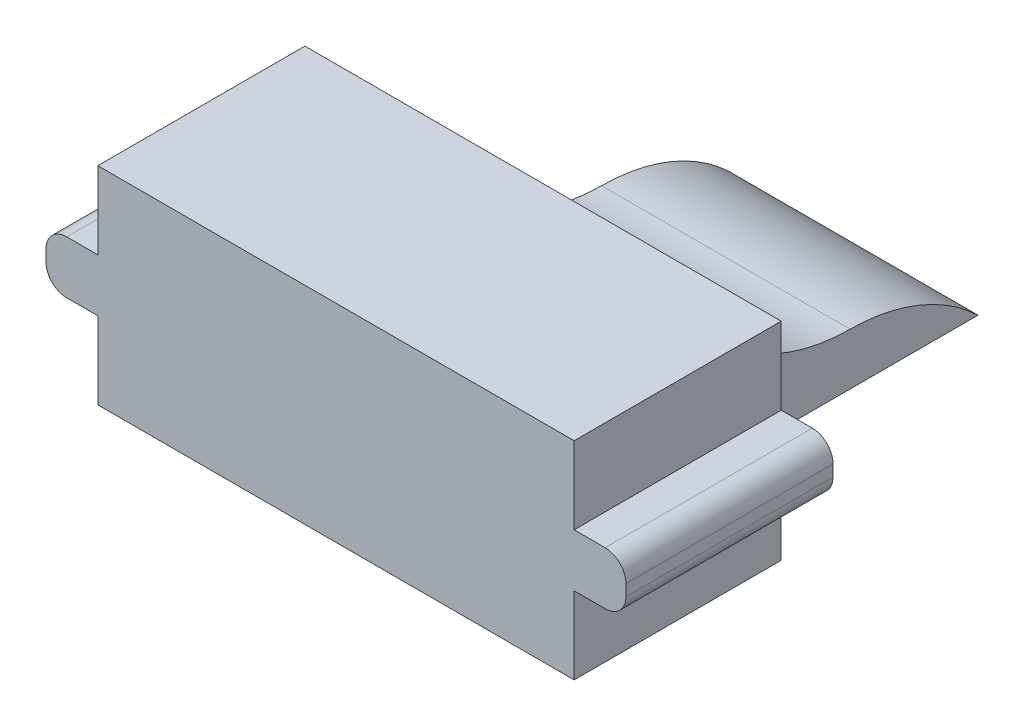
ISO-10303-21;
HEADER;
FILE_DESCRIPTION(('STEP AP214'),'2;1');
FILE_NAME('part.step','',(''),(''),'','','');
FILE_SCHEMA(('AUTOMOTIVE_DESIGN { 1 0 10303 214 1 1 1 1 }'));
ENDSEC;
DATA;
#1=APPLICATION_CONTEXT('core data for automotive mechanical design processes');
#2=APPLICATION_PROTOCOL_DEFINITION('international standard','automotive_design',2000,#1);
#3=PRODUCT_CONTEXT('',#1,'mechanical');
#4=PRODUCT('Part','Part','',(#3));
#5=PRODUCT_RELATED_PRODUCT_CATEGORY('part','',(#4));
#6=PRODUCT_DEFINITION_FORMATION('','',#4);
#7=PRODUCT_DEFINITION_CONTEXT('part definition',#1,'design');
#8=PRODUCT_DEFINITION('design','',#6,#7);
#9=PRODUCT_DEFINITION_SHAPE('','',#8);
#10=(LENGTH_UNIT() NAMED_UNIT(*) SI_UNIT(.MILLI.,.METRE.));
#11=(NAMED_UNIT(*) PLANE_ANGLE_UNIT() SI_UNIT($,.RADIAN.));
#12=(NAMED_UNIT(*) SI_UNIT($,.STERADIAN.) SOLID_ANGLE_UNIT());
#13=UNCERTAINTY_MEASURE_WITH_UNIT(LENGTH_MEASURE(1.E-05),#10,'distance_accuracy_value','');
#14=(GEOMETRIC_REPRESENTATION_CONTEXT(3) GLOBAL_UNCERTAINTY_ASSIGNED_CONTEXT((#13)) GLOBAL_UNIT_ASSIGNED_CONTEXT((#10,
#11,#12)) REPRESENTATION_CONTEXT('',''));
#15=CARTESIAN_POINT('',(0.,0.,0.));
#16=DIRECTION('',(0.,0.,1.));
#17=DIRECTION('',(1.,0.,0.));
#18=AXIS2_PLACEMENT_3D('',#15,#16,#17);
#19=CARTESIAN_POINT('',(0.,0.,0.));
#20=DIRECTION('',(0.,0.,1.));
#21=DIRECTION('',(1.,0.,0.));
#22=AXIS2_PLACEMENT_3D('',#19,#20,#21);
#23=PLANE('',#22);
#24=DIRECTION('',(0.,-1.,0.));
#25=VECTOR('',#24,1.);
#26=CARTESIAN_POINT('',(12.,-10.,0.));
#27=LINE('',#26,#25);
#28=CARTESIAN_POINT('',(12.,10.,0.));
#29=VERTEX_POINT('',#28);
#30=CARTESIAN_POINT('',(12.,-10.,0.));
#31=VERTEX_POINT('',#30);
#32=EDGE_CURVE('E199',#29,#31,#27,.T.);
#33=ORIENTED_EDGE('',*,*,#32,.F.);
#34=DIRECTION('',(-1.,0.,0.));
#35=VECTOR('',#34,1.);
#36=CARTESIAN_POINT('',(-23.,10.,0.));
#37=LINE('',#36,#35);
#38=CARTESIAN_POINT('',(23.,10.,0.));
#39=VERTEX_POINT('',#38);
#40=EDGE_CURVE('E285',#39,#29,#37,.T.);
#41=ORIENTED_EDGE('',*,*,#40,.F.);
#42=DIRECTION('',(0.,1.,0.));
#43=VECTOR('',#42,1.);
#44=CARTESIAN_POINT('',(23.,10.,0.));
#45=LINE('',#44,#43);
#46=CARTESIAN_POINT('',(23.,2.55000000000015,0.));
#47=VERTEX_POINT('',#46);
#48=EDGE_CURVE('E262',#47,#39,#45,.T.);
#49=ORIENTED_EDGE('',*,*,#48,.F.);
#50=DIRECTION('',(-1.,0.,0.));
#51=VECTOR('',#50,1.);
#52=CARTESIAN_POINT('',(28.,2.55000000000015,0.));
#53=LINE('',#52,#51);
#54=CARTESIAN_POINT('',(26.,2.55000000000015,0.));
#55=VERTEX_POINT('',#54);
#56=EDGE_CURVE('E225',#55,#47,#53,.T.);
#57=ORIENTED_EDGE('',*,*,#56,.F.);
#58=CARTESIAN_POINT('',(26.,0.550000000000148,0.));
#59=DIRECTION('',(0.,0.,1.));
#60=DIRECTION('',(1.,0.,0.));
#61=AXIS2_PLACEMENT_3D('',#58,#59,#60);
#62=CIRCLE('',#61,2.);
#63=CARTESIAN_POINT('',(28.,0.550000000000149,0.));
#64=VERTEX_POINT('',#63);
#65=EDGE_CURVE('E347',#55,#64,#62,.F.);
#66=ORIENTED_EDGE('',*,*,#65,.T.);
#67=DIRECTION('',(0.,-1.,0.));
#68=VECTOR('',#67,1.);
#69=CARTESIAN_POINT('',(28.,2.55000000000015,0.));
#70=LINE('',#69,#68);
#71=CARTESIAN_POINT('',(28.,-0.54999999999985,0.));
#72=VERTEX_POINT('',#71);
#73=EDGE_CURVE('E215',#64,#72,#70,.T.);
#74=ORIENTED_EDGE('',*,*,#73,.T.);
#75=CARTESIAN_POINT('',(26.,-0.549999999999851,0.));
#76=DIRECTION('',(0.,0.,1.));
#77=DIRECTION('',(1.,0.,0.));
#78=AXIS2_PLACEMENT_3D('',#75,#76,#77);
#79=CIRCLE('',#78,2.);
#80=CARTESIAN_POINT('',(26.,-2.54999999999985,0.));
#81=VERTEX_POINT('',#80);
#82=EDGE_CURVE('E344',#72,#81,#79,.F.);
#83=ORIENTED_EDGE('',*,*,#82,.T.);
#84=DIRECTION('',(-1.,0.,0.));
#85=VECTOR('',#84,1.);
#86=CARTESIAN_POINT('',(28.,-2.54999999999985,0.));
#87=LINE('',#86,#85);
#88=CARTESIAN_POINT('',(23.,-2.54999999999985,0.));
#89=VERTEX_POINT('',#88);
#90=EDGE_CURVE('E228',#81,#89,#87,.T.);
#91=ORIENTED_EDGE('',*,*,#90,.T.);
#92=CARTESIAN_POINT('',(23.,-10.,0.));
#93=VERTEX_POINT('',#92);
#94=EDGE_CURVE('E280',#93,#89,#45,.T.);
#95=ORIENTED_EDGE('',*,*,#94,.F.);
#96=DIRECTION('',(1.,0.,0.));
#97=VECTOR('',#96,1.);
#98=CARTESIAN_POINT('',(-23.,-10.,0.));
#99=LINE('',#98,#97);
#100=EDGE_CURVE('E295',#31,#93,#99,.T.);
#101=ORIENTED_EDGE('',*,*,#100,.F.);
#102=EDGE_LOOP('',(#33,#41,#49,#57,#66,#74,#83,#91,#95,#101));
#103=FACE_BOUND('',#102,.T.);
#104=ADVANCED_FACE('F43',(#103),#23,.F.);
#105=CARTESIAN_POINT('',(-12.,10.,0.));
#106=VERTEX_POINT('',#105);
#107=CARTESIAN_POINT('',(-23.,10.,0.));
#108=VERTEX_POINT('',#107);
#109=EDGE_CURVE('E284',#106,#108,#37,.T.);
#110=ORIENTED_EDGE('',*,*,#109,.F.);
#111=DIRECTION('',(0.,1.,0.));
#112=VECTOR('',#111,1.);
#113=CARTESIAN_POINT('',(-12.,-10.,0.));
#114=LINE('',#113,#112);
#115=CARTESIAN_POINT('',(-12.,-10.,0.));
#116=VERTEX_POINT('',#115);
#117=EDGE_CURVE('E195',#116,#106,#114,.T.);
#118=ORIENTED_EDGE('',*,*,#117,.F.);
#119=CARTESIAN_POINT('',(-23.,-10.,0.));
#120=VERTEX_POINT('',#119);
#121=EDGE_CURVE('E296',#120,#116,#99,.T.);
#122=ORIENTED_EDGE('',*,*,#121,.F.);
#123=DIRECTION('',(0.,-1.,0.));
#124=VECTOR('',#123,1.);
#125=CARTESIAN_POINT('',(-23.,10.,0.));
#126=LINE('',#125,#124);
#127=CARTESIAN_POINT('',(-23.,-2.54999999999986,0.));
#128=VERTEX_POINT('',#127);
#129=EDGE_CURVE('E289',#128,#120,#126,.T.);
#130=ORIENTED_EDGE('',*,*,#129,.F.);
#131=DIRECTION('',(1.,0.,0.));
#132=VECTOR('',#131,1.);
#133=CARTESIAN_POINT('',(-28.,-2.54999999999986,0.));
#134=LINE('',#133,#132);
#135=CARTESIAN_POINT('',(-26.,-2.54999999999986,0.));
#136=VERTEX_POINT('',#135);
#137=EDGE_CURVE('E253',#136,#128,#134,.T.);
#138=ORIENTED_EDGE('',*,*,#137,.F.);
#139=CARTESIAN_POINT('',(-26.,-0.54999999999986,0.));
#140=DIRECTION('',(0.,0.,1.));
#141=DIRECTION('',(1.,0.,0.));
#142=AXIS2_PLACEMENT_3D('',#139,#140,#141);
#143=CIRCLE('',#142,2.);
#144=CARTESIAN_POINT('',(-28.,-0.54999999999986,0.));
#145=VERTEX_POINT('',#144);
#146=EDGE_CURVE('E322',#136,#145,#143,.F.);
#147=ORIENTED_EDGE('',*,*,#146,.T.);
#148=DIRECTION('',(0.,-1.,0.));
#149=VECTOR('',#148,1.);
#150=CARTESIAN_POINT('',(-28.,2.55000000000014,0.));
#151=LINE('',#150,#149);
#152=CARTESIAN_POINT('',(-28.,0.55000000000014,0.));
#153=VERTEX_POINT('',#152);
#154=EDGE_CURVE('E239',#153,#145,#151,.T.);
#155=ORIENTED_EDGE('',*,*,#154,.F.);
#156=CARTESIAN_POINT('',(-26.,0.55000000000014,0.));
#157=DIRECTION('',(0.,0.,1.));
#158=DIRECTION('',(1.,0.,0.));
#159=AXIS2_PLACEMENT_3D('',#156,#157,#158);
#160=CIRCLE('',#159,2.);
#161=CARTESIAN_POINT('',(-26.,2.55000000000014,0.));
#162=VERTEX_POINT('',#161);
#163=EDGE_CURVE('E325',#153,#162,#160,.F.);
#164=ORIENTED_EDGE('',*,*,#163,.T.);
#165=DIRECTION('',(1.,0.,0.));
#166=VECTOR('',#165,1.);
#167=CARTESIAN_POINT('',(-28.,2.55000000000014,0.));
#168=LINE('',#167,#166);
#169=CARTESIAN_POINT('',(-23.,2.55000000000014,0.));
#170=VERTEX_POINT('',#169);
#171=EDGE_CURVE('E256',#162,#170,#168,.T.);
#172=ORIENTED_EDGE('',*,*,#171,.T.);
#173=EDGE_CURVE('E291',#108,#170,#126,.T.);
#174=ORIENTED_EDGE('',*,*,#173,.F.);
#175=EDGE_LOOP('',(#110,#118,#122,#130,#138,#147,#155,#164,#172,#174));
#176=FACE_BOUND('',#175,.T.);
#177=ADVANCED_FACE('F423',(#176),#23,.F.);
#178=CARTESIAN_POINT('',(23.,10.,20.));
#179=DIRECTION('',(-1.,0.,0.));
#180=DIRECTION('',(0.,0.,1.));
#181=AXIS2_PLACEMENT_3D('',#178,#179,#180);
#182=PLANE('',#181);
#183=DIRECTION('',(0.,1.,0.));
#184=VECTOR('',#183,1.);
#185=CARTESIAN_POINT('',(23.,10.,20.));
#186=LINE('',#185,#184);
#187=CARTESIAN_POINT('',(23.,2.55000000000015,20.));
#188=VERTEX_POINT('',#187);
#189=CARTESIAN_POINT('',(23.,10.,20.));
#190=VERTEX_POINT('',#189);
#191=EDGE_CURVE('E268',#188,#190,#186,.T.);
#192=ORIENTED_EDGE('',*,*,#191,.F.);
#193=DIRECTION('',(0.,0.,-1.));
#194=VECTOR('',#193,1.);
#195=CARTESIAN_POINT('',(23.,2.55000000000015,0.));
#196=LINE('',#195,#194);
#197=EDGE_CURVE('E206',#188,#47,#196,.T.);
#198=ORIENTED_EDGE('',*,*,#197,.T.);
#199=ORIENTED_EDGE('',*,*,#48,.T.);
#200=DIRECTION('',(0.,0.,-1.));
#201=VECTOR('',#200,1.);
#202=CARTESIAN_POINT('',(23.,10.,20.));
#203=LINE('',#202,#201);
#204=EDGE_CURVE('E310',#190,#39,#203,.T.);
#205=ORIENTED_EDGE('',*,*,#204,.F.);
#206=EDGE_LOOP('',(#192,#198,#199,#205));
#207=FACE_BOUND('',#206,.T.);
#208=ADVANCED_FACE('F384',(#207),#182,.F.);
#209=CARTESIAN_POINT('',(-23.,10.,20.));
#210=DIRECTION('',(1.,0.,0.));
#211=DIRECTION('',(0.,1.,0.));
#212=AXIS2_PLACEMENT_3D('',#209,#210,#211);
#213=PLANE('',#212);
#214=DIRECTION('',(0.,0.,1.));
#215=VECTOR('',#214,1.);
#216=CARTESIAN_POINT('',(-23.,-2.54999999999986,0.));
#217=LINE('',#216,#215);
#218=CARTESIAN_POINT('',(-23.,-2.54999999999986,20.));
#219=VERTEX_POINT('',#218);
#220=EDGE_CURVE('E240',#128,#219,#217,.T.);
#221=ORIENTED_EDGE('',*,*,#220,.F.);
#222=ORIENTED_EDGE('',*,*,#129,.T.);
#223=DIRECTION('',(0.,0.,-1.));
#224=VECTOR('',#223,1.);
#225=CARTESIAN_POINT('',(-23.,-10.,20.));
#226=LINE('',#225,#224);
#227=CARTESIAN_POINT('',(-23.,-10.,20.));
#228=VERTEX_POINT('',#227);
#229=EDGE_CURVE('E302',#228,#120,#226,.T.);
#230=ORIENTED_EDGE('',*,*,#229,.F.);
#231=DIRECTION('',(0.,-1.,0.));
#232=VECTOR('',#231,1.);
#233=CARTESIAN_POINT('',(-23.,10.,20.));
#234=LINE('',#233,#232);
#235=EDGE_CURVE('E271',#219,#228,#234,.T.);
#236=ORIENTED_EDGE('',*,*,#235,.F.);
#237=EDGE_LOOP('',(#221,#222,#230,#236));
#238=FACE_BOUND('',#237,.T.);
#239=ADVANCED_FACE('F435',(#238),#213,.F.);
#240=DIRECTION('',(0.,0.,-1.));
#241=VECTOR('',#240,1.);
#242=CARTESIAN_POINT('',(-23.,2.55000000000014,0.));
#243=LINE('',#242,#241);
#244=CARTESIAN_POINT('',(-23.,2.55000000000014,20.));
#245=VERTEX_POINT('',#244);
#246=EDGE_CURVE('E234',#245,#170,#243,.T.);
#247=ORIENTED_EDGE('',*,*,#246,.F.);
#248=CARTESIAN_POINT('',(-23.,10.,20.));
#249=VERTEX_POINT('',#248);
#250=EDGE_CURVE('E272',#249,#245,#234,.T.);
#251=ORIENTED_EDGE('',*,*,#250,.F.);
#252=DIRECTION('',(0.,0.,-1.));
#253=VECTOR('',#252,1.);
#254=CARTESIAN_POINT('',(-23.,10.,20.));
#255=LINE('',#254,#253);
#256=EDGE_CURVE('E306',#249,#108,#255,.T.);
#257=ORIENTED_EDGE('',*,*,#256,.T.);
#258=ORIENTED_EDGE('',*,*,#173,.T.);
#259=EDGE_LOOP('',(#247,#251,#257,#258));
#260=FACE_BOUND('',#259,.T.);
#261=ADVANCED_FACE('F438',(#260),#213,.F.);
#262=ORIENTED_EDGE('',*,*,#94,.T.);
#263=DIRECTION('',(0.,0.,1.));
#264=VECTOR('',#263,1.);
#265=CARTESIAN_POINT('',(23.,-2.54999999999985,0.));
#266=LINE('',#265,#264);
#267=CARTESIAN_POINT('',(23.,-2.54999999999985,20.));
#268=VERTEX_POINT('',#267);
#269=EDGE_CURVE('E201',#89,#268,#266,.T.);
#270=ORIENTED_EDGE('',*,*,#269,.T.);
#271=CARTESIAN_POINT('',(23.,-10.,20.));
#272=VERTEX_POINT('',#271);
#273=EDGE_CURVE('E263',#272,#268,#186,.T.);
#274=ORIENTED_EDGE('',*,*,#273,.F.);
#275=DIRECTION('',(0.,0.,-1.));
#276=VECTOR('',#275,1.);
#277=CARTESIAN_POINT('',(23.,-10.,20.));
#278=LINE('',#277,#276);
#279=EDGE_CURVE('E279',#272,#93,#278,.T.);
#280=ORIENTED_EDGE('',*,*,#279,.T.);
#281=EDGE_LOOP('',(#262,#270,#274,#280));
#282=FACE_BOUND('',#281,.T.);
#283=ADVANCED_FACE('F442',(#282),#182,.F.);
#284=CARTESIAN_POINT('',(-23.,10.,20.));
#285=DIRECTION('',(0.,-1.,0.));
#286=DIRECTION('',(0.,0.,-1.));
#287=AXIS2_PLACEMENT_3D('',#284,#285,#286);
#288=PLANE('',#287);
#289=ORIENTED_EDGE('',*,*,#40,.T.);
#290=EDGE_CURVE('E290',#29,#106,#37,.T.);
#291=ORIENTED_EDGE('',*,*,#290,.T.);
#292=ORIENTED_EDGE('',*,*,#109,.T.);
#293=ORIENTED_EDGE('',*,*,#256,.F.);
#294=DIRECTION('',(-1.,0.,0.));
#295=VECTOR('',#294,1.);
#296=CARTESIAN_POINT('',(-23.,10.,20.));
#297=LINE('',#296,#295);
#298=EDGE_CURVE('E267',#190,#249,#297,.T.);
#299=ORIENTED_EDGE('',*,*,#298,.F.);
#300=ORIENTED_EDGE('',*,*,#204,.T.);
#301=EDGE_LOOP('',(#289,#291,#292,#293,#299,#300));
#302=FACE_BOUND('',#301,.T.);
#303=ADVANCED_FACE('F391',(#302),#288,.F.);
#304=CARTESIAN_POINT('',(-23.,-10.,20.));
#305=DIRECTION('',(0.,1.,0.));
#306=DIRECTION('',(0.,0.,1.));
#307=AXIS2_PLACEMENT_3D('',#304,#305,#306);
#308=PLANE('',#307);
#309=ORIENTED_EDGE('',*,*,#121,.T.);
#310=DIRECTION('',(0.,0.,1.));
#311=VECTOR('',#310,1.);
#312=CARTESIAN_POINT('',(-12.,-10.,-30.));
#313=LINE('',#312,#311);
#314=CARTESIAN_POINT('',(-12.,-10.,-30.));
#315=VERTEX_POINT('',#314);
#316=EDGE_CURVE('E193',#315,#116,#313,.T.);
#317=ORIENTED_EDGE('',*,*,#316,.F.);
#318=DIRECTION('',(-1.,0.,0.));
#319=VECTOR('',#318,1.);
#320=CARTESIAN_POINT('',(12.,-10.,-30.));
#321=LINE('',#320,#319);
#322=CARTESIAN_POINT('',(12.,-10.,-30.));
#323=VERTEX_POINT('',#322);
#324=EDGE_CURVE('E181',#323,#315,#321,.T.);
#325=ORIENTED_EDGE('',*,*,#324,.F.);
#326=DIRECTION('',(0.,0.,1.));
#327=VECTOR('',#326,1.);
#328=CARTESIAN_POINT('',(12.,-10.,-30.));
#329=LINE('',#328,#327);
#330=EDGE_CURVE('E190',#323,#31,#329,.T.);
#331=ORIENTED_EDGE('',*,*,#330,.T.);
#332=ORIENTED_EDGE('',*,*,#100,.T.);
#333=ORIENTED_EDGE('',*,*,#279,.F.);
#334=DIRECTION('',(1.,0.,0.));
#335=VECTOR('',#334,1.);
#336=CARTESIAN_POINT('',(-23.,-10.,20.));
#337=LINE('',#336,#335);
#338=EDGE_CURVE('E276',#228,#272,#337,.T.);
#339=ORIENTED_EDGE('',*,*,#338,.F.);
#340=ORIENTED_EDGE('',*,*,#229,.T.);
#341=EDGE_LOOP('',(#309,#317,#325,#331,#332,#333,#339,#340));
#342=FACE_BOUND('',#341,.T.);
#343=ADVANCED_FACE('F189',(#342),#308,.F.);
#344=CARTESIAN_POINT('',(0.,0.,20.));
#345=DIRECTION('',(0.,0.,1.));
#346=DIRECTION('',(1.,0.,0.));
#347=AXIS2_PLACEMENT_3D('',#344,#345,#346);
#348=PLANE('',#347);
#349=DIRECTION('',(0.,1.,0.));
#350=VECTOR('',#349,1.);
#351=CARTESIAN_POINT('',(28.,2.55000000000015,20.));
#352=LINE('',#351,#350);
#353=CARTESIAN_POINT('',(28.,-0.54999999999985,20.));
#354=VERTEX_POINT('',#353);
#355=CARTESIAN_POINT('',(28.,0.550000000000149,20.));
#356=VERTEX_POINT('',#355);
#357=EDGE_CURVE('E211',#354,#356,#352,.T.);
#358=ORIENTED_EDGE('',*,*,#357,.T.);
#359=CARTESIAN_POINT('',(26.,0.550000000000148,20.));
#360=DIRECTION('',(0.,0.,1.));
#361=DIRECTION('',(1.,0.,0.));
#362=AXIS2_PLACEMENT_3D('',#359,#360,#361);
#363=CIRCLE('',#362,2.);
#364=CARTESIAN_POINT('',(26.,2.55000000000015,20.));
#365=VERTEX_POINT('',#364);
#366=EDGE_CURVE('E359',#356,#365,#363,.T.);
#367=ORIENTED_EDGE('',*,*,#366,.T.);
#368=DIRECTION('',(-1.,0.,0.));
#369=VECTOR('',#368,1.);
#370=CARTESIAN_POINT('',(28.,2.55000000000015,20.));
#371=LINE('',#370,#369);
#372=EDGE_CURVE('E218',#365,#188,#371,.T.);
#373=ORIENTED_EDGE('',*,*,#372,.T.);
#374=ORIENTED_EDGE('',*,*,#191,.T.);
#375=ORIENTED_EDGE('',*,*,#298,.T.);
#376=ORIENTED_EDGE('',*,*,#250,.T.);
#377=DIRECTION('',(1.,0.,0.));
#378=VECTOR('',#377,1.);
#379=CARTESIAN_POINT('',(-28.,2.55000000000014,20.));
#380=LINE('',#379,#378);
#381=CARTESIAN_POINT('',(-26.,2.55000000000014,20.));
#382=VERTEX_POINT('',#381);
#383=EDGE_CURVE('E259',#382,#245,#380,.T.);
#384=ORIENTED_EDGE('',*,*,#383,.F.);
#385=CARTESIAN_POINT('',(-26.,0.55000000000014,20.));
#386=DIRECTION('',(0.,0.,1.));
#387=DIRECTION('',(1.,0.,0.));
#388=AXIS2_PLACEMENT_3D('',#385,#386,#387);
#389=CIRCLE('',#388,2.);
#390=CARTESIAN_POINT('',(-28.,0.55000000000014,20.));
#391=VERTEX_POINT('',#390);
#392=EDGE_CURVE('E334',#382,#391,#389,.T.);
#393=ORIENTED_EDGE('',*,*,#392,.T.);
#394=DIRECTION('',(0.,1.,0.));
#395=VECTOR('',#394,1.);
#396=CARTESIAN_POINT('',(-28.,2.55000000000014,20.));
#397=LINE('',#396,#395);
#398=CARTESIAN_POINT('',(-28.,-0.54999999999986,20.));
#399=VERTEX_POINT('',#398);
#400=EDGE_CURVE('E235',#399,#391,#397,.T.);
#401=ORIENTED_EDGE('',*,*,#400,.F.);
#402=CARTESIAN_POINT('',(-26.,-0.54999999999986,20.));
#403=DIRECTION('',(0.,0.,1.));
#404=DIRECTION('',(1.,0.,0.));
#405=AXIS2_PLACEMENT_3D('',#402,#403,#404);
#406=CIRCLE('',#405,2.);
#407=CARTESIAN_POINT('',(-26.,-2.54999999999986,20.));
#408=VERTEX_POINT('',#407);
#409=EDGE_CURVE('E331',#399,#408,#406,.T.);
#410=ORIENTED_EDGE('',*,*,#409,.T.);
#411=DIRECTION('',(1.,0.,0.));
#412=VECTOR('',#411,1.);
#413=CARTESIAN_POINT('',(-28.,-2.54999999999986,20.));
#414=LINE('',#413,#412);
#415=EDGE_CURVE('E244',#408,#219,#414,.T.);
#416=ORIENTED_EDGE('',*,*,#415,.T.);
#417=ORIENTED_EDGE('',*,*,#235,.T.);
#418=ORIENTED_EDGE('',*,*,#338,.T.);
#419=ORIENTED_EDGE('',*,*,#273,.T.);
#420=DIRECTION('',(-1.,0.,0.));
#421=VECTOR('',#420,1.);
#422=CARTESIAN_POINT('',(28.,-2.54999999999985,20.));
#423=LINE('',#422,#421);
#424=CARTESIAN_POINT('',(26.,-2.54999999999985,20.));
#425=VERTEX_POINT('',#424);
#426=EDGE_CURVE('E231',#425,#268,#423,.T.);
#427=ORIENTED_EDGE('',*,*,#426,.F.);
#428=CARTESIAN_POINT('',(26.,-0.549999999999851,20.));
#429=DIRECTION('',(0.,0.,1.));
#430=DIRECTION('',(1.,0.,0.));
#431=AXIS2_PLACEMENT_3D('',#428,#429,#430);
#432=CIRCLE('',#431,2.);
#433=EDGE_CURVE('E356',#425,#354,#432,.T.);
#434=ORIENTED_EDGE('',*,*,#433,.T.);
#435=EDGE_LOOP('',(#358,#367,#373,#374,#375,#376,#384,#393,#401,#410,#416,#417,#418,#419,#427,#434));
#436=FACE_BOUND('',#435,.T.);
#437=ADVANCED_FACE('F395',(#436),#348,.T.);
#438=CARTESIAN_POINT('',(-28.,2.55000000000014,0.));
#439=DIRECTION('',(0.,-1.,0.));
#440=DIRECTION('',(1.,0.,0.));
#441=AXIS2_PLACEMENT_3D('',#438,#439,#440);
#442=PLANE('',#441);
#443=ORIENTED_EDGE('',*,*,#171,.F.);
#444=DIRECTION('',(0.,0.,-1.));
#445=VECTOR('',#444,1.);
#446=CARTESIAN_POINT('',(-26.,2.55000000000014,20.));
#447=LINE('',#446,#445);
#448=EDGE_CURVE('E328',#162,#382,#447,.F.);
#449=ORIENTED_EDGE('',*,*,#448,.T.);
#450=ORIENTED_EDGE('',*,*,#383,.T.);
#451=ORIENTED_EDGE('',*,*,#246,.T.);
#452=EDGE_LOOP('',(#443,#449,#450,#451));
#453=FACE_BOUND('',#452,.T.);
#454=ADVANCED_FACE('F475',(#453),#442,.F.);
#455=CARTESIAN_POINT('',(-28.,-2.54999999999986,0.));
#456=DIRECTION('',(0.,1.,0.));
#457=DIRECTION('',(-1.,0.,0.));
#458=AXIS2_PLACEMENT_3D('',#455,#456,#457);
#459=PLANE('',#458);
#460=ORIENTED_EDGE('',*,*,#415,.F.);
#461=DIRECTION('',(0.,0.,1.));
#462=VECTOR('',#461,1.);
#463=CARTESIAN_POINT('',(-26.,-2.54999999999986,0.));
#464=LINE('',#463,#462);
#465=EDGE_CURVE('E337',#408,#136,#464,.F.);
#466=ORIENTED_EDGE('',*,*,#465,.T.);
#467=ORIENTED_EDGE('',*,*,#137,.T.);
#468=ORIENTED_EDGE('',*,*,#220,.T.);
#469=EDGE_LOOP('',(#460,#466,#467,#468));
#470=FACE_BOUND('',#469,.T.);
#471=ADVANCED_FACE('F497',(#470),#459,.F.);
#472=CARTESIAN_POINT('',(-28.,0.,0.));
#473=DIRECTION('',(-1.,0.,0.));
#474=DIRECTION('',(0.,0.,1.));
#475=AXIS2_PLACEMENT_3D('',#472,#473,#474);
#476=PLANE('',#475);
#477=ORIENTED_EDGE('',*,*,#400,.T.);
#478=DIRECTION('',(0.,0.,-1.));
#479=VECTOR('',#478,1.);
#480=CARTESIAN_POINT('',(-28.,0.55000000000014,0.));
#481=LINE('',#480,#479);
#482=EDGE_CURVE('E318',#391,#153,#481,.T.);
#483=ORIENTED_EDGE('',*,*,#482,.T.);
#484=ORIENTED_EDGE('',*,*,#154,.T.);
#485=DIRECTION('',(0.,0.,1.));
#486=VECTOR('',#485,1.);
#487=CARTESIAN_POINT('',(-28.,-0.54999999999986,20.));
#488=LINE('',#487,#486);
#489=EDGE_CURVE('E314',#145,#399,#488,.T.);
#490=ORIENTED_EDGE('',*,*,#489,.T.);
#491=EDGE_LOOP('',(#477,#483,#484,#490));
#492=FACE_BOUND('',#491,.T.);
#493=ADVANCED_FACE('F449',(#492),#476,.T.);
#494=CARTESIAN_POINT('',(-26.,0.55000000000014,0.));
#495=DIRECTION('',(0.,0.,1.));
#496=DIRECTION('',(1.,0.,0.));
#497=AXIS2_PLACEMENT_3D('',#494,#495,#496);
#498=CYLINDRICAL_SURFACE('',#497,2.);
#499=ORIENTED_EDGE('',*,*,#392,.F.);
#500=ORIENTED_EDGE('',*,*,#448,.F.);
#501=ORIENTED_EDGE('',*,*,#163,.F.);
#502=ORIENTED_EDGE('',*,*,#482,.F.);
#503=EDGE_LOOP('',(#499,#500,#501,#502));
#504=FACE_BOUND('',#503,.T.);
#505=ADVANCED_FACE('F446',(#504),#498,.T.);
#506=CARTESIAN_POINT('',(-26.,-0.54999999999986,0.));
#507=DIRECTION('',(0.,0.,-1.));
#508=DIRECTION('',(-1.,0.,0.));
#509=AXIS2_PLACEMENT_3D('',#506,#507,#508);
#510=CYLINDRICAL_SURFACE('',#509,2.);
#511=ORIENTED_EDGE('',*,*,#146,.F.);
#512=ORIENTED_EDGE('',*,*,#465,.F.);
#513=ORIENTED_EDGE('',*,*,#409,.F.);
#514=ORIENTED_EDGE('',*,*,#489,.F.);
#515=EDGE_LOOP('',(#511,#512,#513,#514));
#516=FACE_BOUND('',#515,.T.);
#517=ADVANCED_FACE('F448',(#516),#510,.T.);
#518=CARTESIAN_POINT('',(28.,-2.54999999999985,0.));
#519=DIRECTION('',(0.,-1.,0.));
#520=DIRECTION('',(0.,0.,-1.));
#521=AXIS2_PLACEMENT_3D('',#518,#519,#520);
#522=PLANE('',#521);
#523=ORIENTED_EDGE('',*,*,#90,.F.);
#524=DIRECTION('',(0.,0.,1.));
#525=VECTOR('',#524,1.);
#526=CARTESIAN_POINT('',(26.,-2.54999999999985,0.));
#527=LINE('',#526,#525);
#528=EDGE_CURVE('E362',#81,#425,#527,.T.);
#529=ORIENTED_EDGE('',*,*,#528,.T.);
#530=ORIENTED_EDGE('',*,*,#426,.T.);
#531=ORIENTED_EDGE('',*,*,#269,.F.);
#532=EDGE_LOOP('',(#523,#529,#530,#531));
#533=FACE_BOUND('',#532,.T.);
#534=ADVANCED_FACE('F452',(#533),#522,.T.);
#535=CARTESIAN_POINT('',(28.,2.55000000000015,0.));
#536=DIRECTION('',(0.,1.,0.));
#537=DIRECTION('',(0.,0.,1.));
#538=AXIS2_PLACEMENT_3D('',#535,#536,#537);
#539=PLANE('',#538);
#540=ORIENTED_EDGE('',*,*,#372,.F.);
#541=DIRECTION('',(0.,0.,-1.));
#542=VECTOR('',#541,1.);
#543=CARTESIAN_POINT('',(26.,2.55000000000015,0.));
#544=LINE('',#543,#542);
#545=EDGE_CURVE('E340',#365,#55,#544,.T.);
#546=ORIENTED_EDGE('',*,*,#545,.T.);
#547=ORIENTED_EDGE('',*,*,#56,.T.);
#548=ORIENTED_EDGE('',*,*,#197,.F.);
#549=EDGE_LOOP('',(#540,#546,#547,#548));
#550=FACE_BOUND('',#549,.T.);
#551=ADVANCED_FACE('F401',(#550),#539,.T.);
#552=CARTESIAN_POINT('',(28.,0.,0.));
#553=DIRECTION('',(1.,0.,0.));
#554=DIRECTION('',(0.,0.,1.));
#555=AXIS2_PLACEMENT_3D('',#552,#553,#554);
#556=PLANE('',#555);
#557=ORIENTED_EDGE('',*,*,#73,.F.);
#558=DIRECTION('',(0.,0.,-1.));
#559=VECTOR('',#558,1.);
#560=CARTESIAN_POINT('',(28.,0.550000000000149,0.));
#561=LINE('',#560,#559);
#562=EDGE_CURVE('E353',#64,#356,#561,.F.);
#563=ORIENTED_EDGE('',*,*,#562,.T.);
#564=ORIENTED_EDGE('',*,*,#357,.F.);
#565=DIRECTION('',(0.,0.,1.));
#566=VECTOR('',#565,1.);
#567=CARTESIAN_POINT('',(28.,-0.54999999999985,0.));
#568=LINE('',#567,#566);
#569=EDGE_CURVE('E350',#354,#72,#568,.F.);
#570=ORIENTED_EDGE('',*,*,#569,.T.);
#571=EDGE_LOOP('',(#557,#563,#564,#570));
#572=FACE_BOUND('',#571,.T.);
#573=ADVANCED_FACE('F407',(#572),#556,.T.);
#574=CARTESIAN_POINT('',(26.,0.550000000000148,0.));
#575=DIRECTION('',(0.,0.,-1.));
#576=DIRECTION('',(-1.,0.,0.));
#577=AXIS2_PLACEMENT_3D('',#574,#575,#576);
#578=CYLINDRICAL_SURFACE('',#577,2.);
#579=ORIENTED_EDGE('',*,*,#366,.F.);
#580=ORIENTED_EDGE('',*,*,#562,.F.);
#581=ORIENTED_EDGE('',*,*,#65,.F.);
#582=ORIENTED_EDGE('',*,*,#545,.F.);
#583=EDGE_LOOP('',(#579,#580,#581,#582));
#584=FACE_BOUND('',#583,.T.);
#585=ADVANCED_FACE('F410',(#584),#578,.T.);
#586=CARTESIAN_POINT('',(26.,-0.549999999999851,0.));
#587=DIRECTION('',(0.,0.,1.));
#588=DIRECTION('',(1.,0.,0.));
#589=AXIS2_PLACEMENT_3D('',#586,#587,#588);
#590=CYLINDRICAL_SURFACE('',#589,2.);
#591=ORIENTED_EDGE('',*,*,#82,.F.);
#592=ORIENTED_EDGE('',*,*,#569,.F.);
#593=ORIENTED_EDGE('',*,*,#433,.F.);
#594=ORIENTED_EDGE('',*,*,#528,.F.);
#595=EDGE_LOOP('',(#591,#592,#593,#594));
#596=FACE_BOUND('',#595,.T.);
#597=ADVANCED_FACE('F412',(#596),#590,.T.);
#598=CARTESIAN_POINT('',(12.,-10.,-30.));
#599=DIRECTION('',(-1.,0.,0.));
#600=DIRECTION('',(0.,-1.,0.));
#601=AXIS2_PLACEMENT_3D('',#598,#599,#600);
#602=PLANE('',#601);
#603=ORIENTED_EDGE('',*,*,#330,.F.);
#604=CARTESIAN_POINT('',(12.,-22.9994515751047,-17.5495277701403));
#605=DIRECTION('',(-1.,0.,0.));
#606=DIRECTION('',(0.,-1.,0.));
#607=AXIS2_PLACEMENT_3D('',#604,#605,#606);
#608=CIRCLE('',#607,18.);
#609=CARTESIAN_POINT('',(12.,-4.99972578755235,-17.6488835597196));
#610=VERTEX_POINT('',#609);
#611=EDGE_CURVE('E66',#323,#610,#608,.F.);
#612=ORIENTED_EDGE('',*,*,#611,.T.);
#613=CARTESIAN_POINT('',(12.,13.,-17.7482393492988));
#614=DIRECTION('',(-1.,0.,0.));
#615=DIRECTION('',(0.,-1.,0.));
#616=AXIS2_PLACEMENT_3D('',#613,#614,#615);
#617=CIRCLE('',#616,18.);
#618=EDGE_CURVE('E366',#610,#29,#617,.T.);
#619=ORIENTED_EDGE('',*,*,#618,.T.);
#620=ORIENTED_EDGE('',*,*,#32,.T.);
#621=EDGE_LOOP('',(#603,#612,#619,#620));
#622=FACE_BOUND('',#621,.T.);
#623=ADVANCED_FACE('F197',(#622),#602,.F.);
#624=CARTESIAN_POINT('',(-12.,-10.,-30.));
#625=DIRECTION('',(1.,0.,0.));
#626=DIRECTION('',(0.,0.,-1.));
#627=AXIS2_PLACEMENT_3D('',#624,#625,#626);
#628=PLANE('',#627);
#629=CARTESIAN_POINT('',(-12.,13.,-17.7482393492988));
#630=DIRECTION('',(1.,0.,0.));
#631=DIRECTION('',(0.,0.,-1.));
#632=AXIS2_PLACEMENT_3D('',#629,#630,#631);
#633=CIRCLE('',#632,18.);
#634=CARTESIAN_POINT('',(-12.,-4.99972578755235,-17.6488835597196));
#635=VERTEX_POINT('',#634);
#636=EDGE_CURVE('E183',#106,#635,#633,.T.);
#637=ORIENTED_EDGE('',*,*,#636,.T.);
#638=CARTESIAN_POINT('',(-12.,-22.9994515751047,-17.5495277701403));
#639=DIRECTION('',(1.,0.,0.));
#640=DIRECTION('',(0.,0.,-1.));
#641=AXIS2_PLACEMENT_3D('',#638,#639,#640);
#642=CIRCLE('',#641,18.);
#643=EDGE_CURVE('E11',#635,#315,#642,.F.);
#644=ORIENTED_EDGE('',*,*,#643,.T.);
#645=ORIENTED_EDGE('',*,*,#316,.T.);
#646=ORIENTED_EDGE('',*,*,#117,.T.);
#647=EDGE_LOOP('',(#637,#644,#645,#646));
#648=FACE_BOUND('',#647,.T.);
#649=ADVANCED_FACE('F481',(#648),#628,.F.);
#650=CARTESIAN_POINT('',(0.,13.,-17.7482393492988));
#651=DIRECTION('',(1.,0.,0.));
#652=DIRECTION('',(0.,0.,-1.));
#653=AXIS2_PLACEMENT_3D('',#650,#651,#652);
#654=CYLINDRICAL_SURFACE('',#653,18.);
#655=ORIENTED_EDGE('',*,*,#618,.F.);
#656=DIRECTION('',(1.,0.,0.));
#657=VECTOR('',#656,1.);
#658=CARTESIAN_POINT('',(0.,-4.99972578755235,-17.6488835597196));
#659=LINE('',#658,#657);
#660=EDGE_CURVE('E52',#610,#635,#659,.F.);
#661=ORIENTED_EDGE('',*,*,#660,.T.);
#662=ORIENTED_EDGE('',*,*,#636,.F.);
#663=ORIENTED_EDGE('',*,*,#290,.F.);
#664=EDGE_LOOP('',(#655,#661,#662,#663));
#665=FACE_BOUND('',#664,.T.);
#666=ADVANCED_FACE('F479',(#665),#654,.F.);
#667=CARTESIAN_POINT('',(0.,-22.9994515751047,-17.5495277701403));
#668=DIRECTION('',(1.,0.,0.));
#669=DIRECTION('',(0.,0.,-1.));
#670=AXIS2_PLACEMENT_3D('',#667,#668,#669);
#671=CYLINDRICAL_SURFACE('',#670,18.);
#672=ORIENTED_EDGE('',*,*,#643,.F.);
#673=ORIENTED_EDGE('',*,*,#660,.F.);
#674=ORIENTED_EDGE('',*,*,#611,.F.);
#675=ORIENTED_EDGE('',*,*,#324,.T.);
#676=EDGE_LOOP('',(#672,#673,#674,#675));
#677=FACE_BOUND('',#676,.T.);
#678=ADVANCED_FACE('F45',(#677),#671,.T.);
#679=CLOSED_SHELL('',(#104,#177,#208,#239,#261,#283,#303,#343,#437,#454,#471,#493,#505,#517,
#534,#551,#573,#585,#597,#623,#649,#666,#678));
#680=MANIFOLD_SOLID_BREP('B2',#679);
#681=ADVANCED_BREP_SHAPE_REPRESENTATION('',(#18,#680),#14);
#682=SHAPE_DEFINITION_REPRESENTATION(#9,#681);
ENDSEC;
END-ISO-10303-21;
